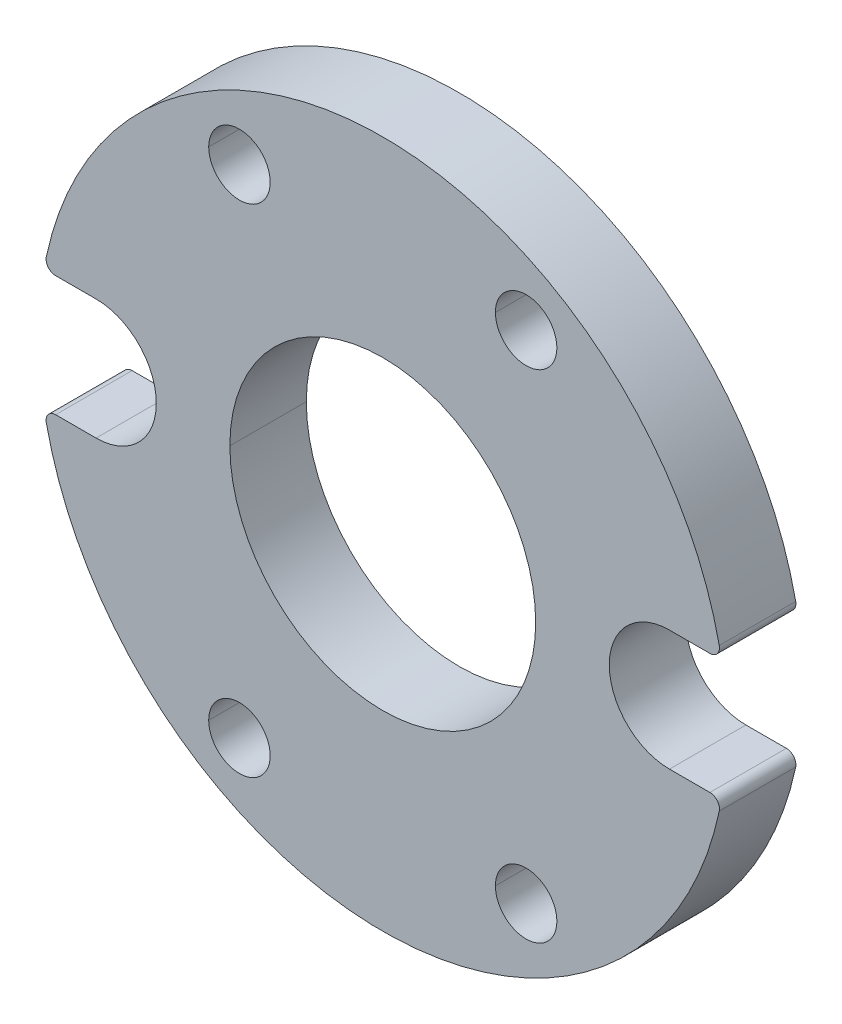
ISO-10303-21;
HEADER;
FILE_DESCRIPTION(('STEP AP214'),'2;1');
FILE_NAME('part.step','',(''),(''),'','','');
FILE_SCHEMA(('AUTOMOTIVE_DESIGN { 1 0 10303 214 1 1 1 1 }'));
ENDSEC;
DATA;
#1=APPLICATION_CONTEXT('core data for automotive mechanical design processes');
#2=APPLICATION_PROTOCOL_DEFINITION('international standard','automotive_design',2000,#1);
#3=PRODUCT_CONTEXT('',#1,'mechanical');
#4=PRODUCT('Part','Part','',(#3));
#5=PRODUCT_RELATED_PRODUCT_CATEGORY('part','',(#4));
#6=PRODUCT_DEFINITION_FORMATION('','',#4);
#7=PRODUCT_DEFINITION_CONTEXT('part definition',#1,'design');
#8=PRODUCT_DEFINITION('design','',#6,#7);
#9=PRODUCT_DEFINITION_SHAPE('','',#8);
#10=(LENGTH_UNIT() NAMED_UNIT(*) SI_UNIT(.MILLI.,.METRE.));
#11=(NAMED_UNIT(*) PLANE_ANGLE_UNIT() SI_UNIT($,.RADIAN.));
#12=(NAMED_UNIT(*) SI_UNIT($,.STERADIAN.) SOLID_ANGLE_UNIT());
#13=UNCERTAINTY_MEASURE_WITH_UNIT(LENGTH_MEASURE(1.E-05),#10,'distance_accuracy_value','');
#14=(GEOMETRIC_REPRESENTATION_CONTEXT(3) GLOBAL_UNCERTAINTY_ASSIGNED_CONTEXT((#13)) GLOBAL_UNIT_ASSIGNED_CONTEXT((#10,
#11,#12)) REPRESENTATION_CONTEXT('',''));
#15=CARTESIAN_POINT('',(0.,0.,0.));
#16=DIRECTION('',(0.,0.,1.));
#17=DIRECTION('',(1.,0.,0.));
#18=AXIS2_PLACEMENT_3D('',#15,#16,#17);
#19=CARTESIAN_POINT('',(27.1703940438854,5.79375,3.175));
#20=DIRECTION('',(0.,0.,-1.));
#21=DIRECTION('',(-1.,0.,0.));
#22=AXIS2_PLACEMENT_3D('',#19,#20,#21);
#23=CYLINDRICAL_SURFACE('',#22,0.79375);
#24=CARTESIAN_POINT('',(27.1703940438854,5.79375,-3.175));
#25=DIRECTION('',(0.,0.,-1.));
#26=DIRECTION('',(1.,0.,0.));
#27=AXIS2_PLACEMENT_3D('',#24,#25,#26);
#28=CIRCLE('',#27,0.79375);
#29=CARTESIAN_POINT('',(27.9466910165678,5.95928571428571,-3.175));
#30=VERTEX_POINT('',#29);
#31=CARTESIAN_POINT('',(27.1703940438854,5.,-3.175));
#32=VERTEX_POINT('',#31);
#33=EDGE_CURVE('E364',#30,#32,#28,.T.);
#34=ORIENTED_EDGE('',*,*,#33,.F.);
#35=DIRECTION('',(0.,0.,-1.));
#36=VECTOR('',#35,1.);
#37=CARTESIAN_POINT('',(27.9466910165678,5.95928571428571,3.175));
#38=LINE('',#37,#36);
#39=CARTESIAN_POINT('',(27.9466910165678,5.95928571428571,3.175));
#40=VERTEX_POINT('',#39);
#41=EDGE_CURVE('E263',#40,#30,#38,.T.);
#42=ORIENTED_EDGE('',*,*,#41,.F.);
#43=CARTESIAN_POINT('',(27.1703940438854,5.79375,3.175));
#44=DIRECTION('',(0.,0.,1.));
#45=DIRECTION('',(1.,0.,0.));
#46=AXIS2_PLACEMENT_3D('',#43,#44,#45);
#47=CIRCLE('',#46,0.79375);
#48=CARTESIAN_POINT('',(27.1703940438854,5.,3.175));
#49=VERTEX_POINT('',#48);
#50=EDGE_CURVE('E375',#49,#40,#47,.T.);
#51=ORIENTED_EDGE('',*,*,#50,.F.);
#52=DIRECTION('',(0.,0.,1.));
#53=VECTOR('',#52,1.);
#54=CARTESIAN_POINT('',(27.1703940438854,5.,3.175));
#55=LINE('',#54,#53);
#56=EDGE_CURVE('E291',#32,#49,#55,.T.);
#57=ORIENTED_EDGE('',*,*,#56,.F.);
#58=EDGE_LOOP('',(#34,#42,#51,#57));
#59=FACE_BOUND('',#58,.T.);
#60=ADVANCED_FACE('F17',(#59),#23,.T.);
#61=CARTESIAN_POINT('',(-27.1703940438854,5.79375,3.175));
#62=DIRECTION('',(0.,0.,-1.));
#63=DIRECTION('',(-1.,0.,0.));
#64=AXIS2_PLACEMENT_3D('',#61,#62,#63);
#65=CYLINDRICAL_SURFACE('',#64,0.79375);
#66=DIRECTION('',(0.,0.,-1.));
#67=VECTOR('',#66,1.);
#68=CARTESIAN_POINT('',(-27.9641440438854,5.79375,3.175));
#69=LINE('',#68,#67);
#70=CARTESIAN_POINT('',(-27.9641440438854,5.79375,3.175));
#71=VERTEX_POINT('',#70);
#72=CARTESIAN_POINT('',(-27.9641440438854,5.79375,-3.175));
#73=VERTEX_POINT('',#72);
#74=EDGE_CURVE('E377',#71,#73,#69,.T.);
#75=ORIENTED_EDGE('',*,*,#74,.F.);
#76=CARTESIAN_POINT('',(-27.1703940438854,5.79375,3.175));
#77=DIRECTION('',(0.,0.,1.));
#78=DIRECTION('',(1.,0.,0.));
#79=AXIS2_PLACEMENT_3D('',#76,#77,#78);
#80=CIRCLE('',#79,0.79375);
#81=CARTESIAN_POINT('',(-27.9466910165678,5.95928571428572,3.175));
#82=VERTEX_POINT('',#81);
#83=EDGE_CURVE('E303',#82,#71,#80,.T.);
#84=ORIENTED_EDGE('',*,*,#83,.F.);
#85=DIRECTION('',(0.,0.,1.));
#86=VECTOR('',#85,1.);
#87=CARTESIAN_POINT('',(-27.9466910165678,5.95928571428572,3.175));
#88=LINE('',#87,#86);
#89=CARTESIAN_POINT('',(-27.9466910165678,5.95928571428572,-3.175));
#90=VERTEX_POINT('',#89);
#91=EDGE_CURVE('E281',#90,#82,#88,.T.);
#92=ORIENTED_EDGE('',*,*,#91,.F.);
#93=CARTESIAN_POINT('',(-27.1703940438854,5.79375,-3.175));
#94=DIRECTION('',(0.,0.,-1.));
#95=DIRECTION('',(1.,0.,0.));
#96=AXIS2_PLACEMENT_3D('',#93,#94,#95);
#97=CIRCLE('',#96,0.79375);
#98=EDGE_CURVE('E338',#73,#90,#97,.T.);
#99=ORIENTED_EDGE('',*,*,#98,.F.);
#100=EDGE_LOOP('',(#75,#84,#92,#99));
#101=FACE_BOUND('',#100,.T.);
#102=ADVANCED_FACE('F564',(#101),#65,.T.);
#103=CARTESIAN_POINT('',(27.1703940438854,-5.79375,3.175));
#104=DIRECTION('',(0.,0.,-1.));
#105=DIRECTION('',(-1.,0.,0.));
#106=AXIS2_PLACEMENT_3D('',#103,#104,#105);
#107=CYLINDRICAL_SURFACE('',#106,0.79375);
#108=CARTESIAN_POINT('',(27.1703940438854,-5.79375,-3.175));
#109=DIRECTION('',(0.,0.,-1.));
#110=DIRECTION('',(1.,0.,0.));
#111=AXIS2_PLACEMENT_3D('',#108,#109,#110);
#112=CIRCLE('',#111,0.79375);
#113=CARTESIAN_POINT('',(27.1703940438854,-5.,-3.175));
#114=VERTEX_POINT('',#113);
#115=CARTESIAN_POINT('',(27.9466910165678,-5.95928571428571,-3.175));
#116=VERTEX_POINT('',#115);
#117=EDGE_CURVE('E449',#114,#116,#112,.T.);
#118=ORIENTED_EDGE('',*,*,#117,.F.);
#119=DIRECTION('',(0.,0.,-1.));
#120=VECTOR('',#119,1.);
#121=CARTESIAN_POINT('',(27.1703940438854,-5.,-3.175));
#122=LINE('',#121,#120);
#123=CARTESIAN_POINT('',(27.1703940438854,-5.,3.175));
#124=VERTEX_POINT('',#123);
#125=EDGE_CURVE('E43',#124,#114,#122,.T.);
#126=ORIENTED_EDGE('',*,*,#125,.F.);
#127=CARTESIAN_POINT('',(27.1703940438854,-5.79375,3.175));
#128=DIRECTION('',(0.,0.,1.));
#129=DIRECTION('',(1.,0.,0.));
#130=AXIS2_PLACEMENT_3D('',#127,#128,#129);
#131=CIRCLE('',#130,0.79375);
#132=CARTESIAN_POINT('',(27.9466910165678,-5.95928571428571,3.175));
#133=VERTEX_POINT('',#132);
#134=EDGE_CURVE('E288',#133,#124,#131,.T.);
#135=ORIENTED_EDGE('',*,*,#134,.F.);
#136=DIRECTION('',(0.,0.,1.));
#137=VECTOR('',#136,1.);
#138=CARTESIAN_POINT('',(27.9466910165678,-5.95928571428571,3.175));
#139=LINE('',#138,#137);
#140=EDGE_CURVE('E284',#116,#133,#139,.T.);
#141=ORIENTED_EDGE('',*,*,#140,.F.);
#142=EDGE_LOOP('',(#118,#126,#135,#141));
#143=FACE_BOUND('',#142,.T.);
#144=ADVANCED_FACE('F544',(#143),#107,.T.);
#145=CARTESIAN_POINT('',(-27.1703940438854,-5.79375,3.175));
#146=DIRECTION('',(0.,0.,-1.));
#147=DIRECTION('',(-1.,0.,0.));
#148=AXIS2_PLACEMENT_3D('',#145,#146,#147);
#149=CYLINDRICAL_SURFACE('',#148,0.79375);
#150=DIRECTION('',(0.,0.,-1.));
#151=VECTOR('',#150,1.);
#152=CARTESIAN_POINT('',(-27.9641440438854,-5.79375,3.175));
#153=LINE('',#152,#151);
#154=CARTESIAN_POINT('',(-27.9641440438854,-5.79375,3.175));
#155=VERTEX_POINT('',#154);
#156=CARTESIAN_POINT('',(-27.9641440438854,-5.79375,-3.175));
#157=VERTEX_POINT('',#156);
#158=EDGE_CURVE('E271',#155,#157,#153,.T.);
#159=ORIENTED_EDGE('',*,*,#158,.F.);
#160=CARTESIAN_POINT('',(-27.1703940438854,-5.79375,3.175));
#161=DIRECTION('',(0.,0.,1.));
#162=DIRECTION('',(1.,0.,0.));
#163=AXIS2_PLACEMENT_3D('',#160,#161,#162);
#164=CIRCLE('',#163,0.79375);
#165=CARTESIAN_POINT('',(-27.1703940438854,-5.,3.175));
#166=VERTEX_POINT('',#165);
#167=EDGE_CURVE('E276',#166,#155,#164,.T.);
#168=ORIENTED_EDGE('',*,*,#167,.F.);
#169=DIRECTION('',(0.,0.,1.));
#170=VECTOR('',#169,1.);
#171=CARTESIAN_POINT('',(-27.1703940438854,-5.,3.175));
#172=LINE('',#171,#170);
#173=CARTESIAN_POINT('',(-27.1703940438854,-5.,-3.175));
#174=VERTEX_POINT('',#173);
#175=EDGE_CURVE('E28',#174,#166,#172,.T.);
#176=ORIENTED_EDGE('',*,*,#175,.F.);
#177=CARTESIAN_POINT('',(-27.1703940438854,-5.79375,-3.175));
#178=DIRECTION('',(0.,0.,-1.));
#179=DIRECTION('',(1.,0.,0.));
#180=AXIS2_PLACEMENT_3D('',#177,#178,#179);
#181=CIRCLE('',#180,0.79375);
#182=EDGE_CURVE('E349',#157,#174,#181,.T.);
#183=ORIENTED_EDGE('',*,*,#182,.F.);
#184=EDGE_LOOP('',(#159,#168,#176,#183));
#185=FACE_BOUND('',#184,.T.);
#186=ADVANCED_FACE('F535',(#185),#149,.T.);
#187=CARTESIAN_POINT('',(-23.8125,0.,-3.175));
#188=DIRECTION('',(0.,0.,1.));
#189=DIRECTION('',(1.,0.,0.));
#190=AXIS2_PLACEMENT_3D('',#187,#188,#189);
#191=CYLINDRICAL_SURFACE('',#190,5.);
#192=DIRECTION('',(0.,0.,1.));
#193=VECTOR('',#192,1.);
#194=CARTESIAN_POINT('',(-18.8125,0.,-3.175));
#195=LINE('',#194,#193);
#196=CARTESIAN_POINT('',(-18.8125,0.,-3.175));
#197=VERTEX_POINT('',#196);
#198=CARTESIAN_POINT('',(-18.8125,0.,3.175));
#199=VERTEX_POINT('',#198);
#200=EDGE_CURVE('E337',#197,#199,#195,.T.);
#201=ORIENTED_EDGE('',*,*,#200,.F.);
#202=CARTESIAN_POINT('',(-23.8125,0.,-3.175));
#203=DIRECTION('',(0.,0.,1.));
#204=DIRECTION('',(1.,0.,0.));
#205=AXIS2_PLACEMENT_3D('',#202,#203,#204);
#206=CIRCLE('',#205,5.);
#207=CARTESIAN_POINT('',(-23.8125,-5.,-3.175));
#208=VERTEX_POINT('',#207);
#209=EDGE_CURVE('E358',#208,#197,#206,.T.);
#210=ORIENTED_EDGE('',*,*,#209,.F.);
#211=DIRECTION('',(0.,0.,1.));
#212=VECTOR('',#211,1.);
#213=CARTESIAN_POINT('',(-23.8125,-5.,-3.175));
#214=LINE('',#213,#212);
#215=CARTESIAN_POINT('',(-23.8125,-5.,3.175));
#216=VERTEX_POINT('',#215);
#217=EDGE_CURVE('E11',#208,#216,#214,.T.);
#218=ORIENTED_EDGE('',*,*,#217,.T.);
#219=CARTESIAN_POINT('',(-23.8125,0.,3.175));
#220=DIRECTION('',(0.,0.,1.));
#221=DIRECTION('',(1.,0.,0.));
#222=AXIS2_PLACEMENT_3D('',#219,#220,#221);
#223=CIRCLE('',#222,5.);
#224=EDGE_CURVE('E302',#216,#199,#223,.T.);
#225=ORIENTED_EDGE('',*,*,#224,.T.);
#226=EDGE_LOOP('',(#201,#210,#218,#225));
#227=FACE_BOUND('',#226,.T.);
#228=ADVANCED_FACE('F514',(#227),#191,.F.);
#229=CARTESIAN_POINT('',(0.,5.,-3.175));
#230=DIRECTION('',(0.,1.,0.));
#231=DIRECTION('',(1.,0.,0.));
#232=AXIS2_PLACEMENT_3D('',#229,#230,#231);
#233=PLANE('',#232);
#234=DIRECTION('',(-1.,0.,0.));
#235=VECTOR('',#234,1.);
#236=CARTESIAN_POINT('',(0.,5.,3.175));
#237=LINE('',#236,#235);
#238=CARTESIAN_POINT('',(-23.8125,5.,3.175));
#239=VERTEX_POINT('',#238);
#240=CARTESIAN_POINT('',(-27.1703940438854,5.,3.175));
#241=VERTEX_POINT('',#240);
#242=EDGE_CURVE('E299',#239,#241,#237,.T.);
#243=ORIENTED_EDGE('',*,*,#242,.T.);
#244=DIRECTION('',(0.,0.,-1.));
#245=VECTOR('',#244,1.);
#246=CARTESIAN_POINT('',(-27.1703940438854,5.,-3.175));
#247=LINE('',#246,#245);
#248=CARTESIAN_POINT('',(-27.1703940438854,5.,-3.175));
#249=VERTEX_POINT('',#248);
#250=EDGE_CURVE('E265',#241,#249,#247,.T.);
#251=ORIENTED_EDGE('',*,*,#250,.T.);
#252=DIRECTION('',(-1.,0.,0.));
#253=VECTOR('',#252,1.);
#254=CARTESIAN_POINT('',(0.,5.,-3.175));
#255=LINE('',#254,#253);
#256=CARTESIAN_POINT('',(-23.8125,5.,-3.175));
#257=VERTEX_POINT('',#256);
#258=EDGE_CURVE('E343',#257,#249,#255,.T.);
#259=ORIENTED_EDGE('',*,*,#258,.F.);
#260=DIRECTION('',(0.,0.,1.));
#261=VECTOR('',#260,1.);
#262=CARTESIAN_POINT('',(-23.8125,5.,-3.175));
#263=LINE('',#262,#261);
#264=EDGE_CURVE('E336',#257,#239,#263,.T.);
#265=ORIENTED_EDGE('',*,*,#264,.T.);
#266=EDGE_LOOP('',(#243,#251,#259,#265));
#267=FACE_BOUND('',#266,.T.);
#268=ADVANCED_FACE('F524',(#267),#233,.F.);
#269=CARTESIAN_POINT('',(0.,-5.,-3.175));
#270=DIRECTION('',(0.,1.,0.));
#271=DIRECTION('',(1.,0.,0.));
#272=AXIS2_PLACEMENT_3D('',#269,#270,#271);
#273=PLANE('',#272);
#274=DIRECTION('',(-1.,0.,0.));
#275=VECTOR('',#274,1.);
#276=CARTESIAN_POINT('',(0.,-5.,-3.175));
#277=LINE('',#276,#275);
#278=EDGE_CURVE('E353',#208,#174,#277,.T.);
#279=ORIENTED_EDGE('',*,*,#278,.T.);
#280=ORIENTED_EDGE('',*,*,#175,.T.);
#281=DIRECTION('',(-1.,0.,0.));
#282=VECTOR('',#281,1.);
#283=CARTESIAN_POINT('',(0.,-5.,3.175));
#284=LINE('',#283,#282);
#285=EDGE_CURVE('E279',#216,#166,#284,.T.);
#286=ORIENTED_EDGE('',*,*,#285,.F.);
#287=ORIENTED_EDGE('',*,*,#217,.F.);
#288=EDGE_LOOP('',(#279,#280,#286,#287));
#289=FACE_BOUND('',#288,.T.);
#290=ADVANCED_FACE('F530',(#289),#273,.T.);
#291=CARTESIAN_POINT('',(23.8125,0.,-3.175));
#292=DIRECTION('',(0.,0.,1.));
#293=DIRECTION('',(1.,0.,0.));
#294=AXIS2_PLACEMENT_3D('',#291,#292,#293);
#295=CYLINDRICAL_SURFACE('',#294,5.);
#296=CARTESIAN_POINT('',(23.8125,0.,3.175));
#297=DIRECTION('',(0.,0.,1.));
#298=DIRECTION('',(1.,0.,0.));
#299=AXIS2_PLACEMENT_3D('',#296,#297,#298);
#300=CIRCLE('',#299,5.);
#301=CARTESIAN_POINT('',(23.8125,5.,3.175));
#302=VERTEX_POINT('',#301);
#303=CARTESIAN_POINT('',(23.8125,-5.,3.175));
#304=VERTEX_POINT('',#303);
#305=EDGE_CURVE('E376',#302,#304,#300,.T.);
#306=ORIENTED_EDGE('',*,*,#305,.T.);
#307=DIRECTION('',(0.,0.,1.));
#308=VECTOR('',#307,1.);
#309=CARTESIAN_POINT('',(23.8125,-5.,-3.175));
#310=LINE('',#309,#308);
#311=CARTESIAN_POINT('',(23.8125,-5.,-3.175));
#312=VERTEX_POINT('',#311);
#313=EDGE_CURVE('E85',#312,#304,#310,.T.);
#314=ORIENTED_EDGE('',*,*,#313,.F.);
#315=CARTESIAN_POINT('',(23.8125,0.,-3.175));
#316=DIRECTION('',(0.,0.,1.));
#317=DIRECTION('',(1.,0.,0.));
#318=AXIS2_PLACEMENT_3D('',#315,#316,#317);
#319=CIRCLE('',#318,5.);
#320=CARTESIAN_POINT('',(23.8125,5.,-3.175));
#321=VERTEX_POINT('',#320);
#322=EDGE_CURVE('E405',#321,#312,#319,.T.);
#323=ORIENTED_EDGE('',*,*,#322,.F.);
#324=DIRECTION('',(0.,0.,1.));
#325=VECTOR('',#324,1.);
#326=CARTESIAN_POINT('',(23.8125,5.,-3.175));
#327=LINE('',#326,#325);
#328=EDGE_CURVE('E71',#321,#302,#327,.T.);
#329=ORIENTED_EDGE('',*,*,#328,.T.);
#330=EDGE_LOOP('',(#306,#314,#323,#329));
#331=FACE_BOUND('',#330,.T.);
#332=ADVANCED_FACE('F549',(#331),#295,.F.);
#333=CARTESIAN_POINT('',(0.,-5.,-3.175));
#334=DIRECTION('',(0.,-1.,0.));
#335=DIRECTION('',(0.,0.,-1.));
#336=AXIS2_PLACEMENT_3D('',#333,#334,#335);
#337=PLANE('',#336);
#338=DIRECTION('',(1.,0.,0.));
#339=VECTOR('',#338,1.);
#340=CARTESIAN_POINT('',(0.,-5.,3.175));
#341=LINE('',#340,#339);
#342=EDGE_CURVE('E425',#304,#124,#341,.T.);
#343=ORIENTED_EDGE('',*,*,#342,.T.);
#344=ORIENTED_EDGE('',*,*,#125,.T.);
#345=DIRECTION('',(1.,0.,0.));
#346=VECTOR('',#345,1.);
#347=CARTESIAN_POINT('',(0.,-5.,-3.175));
#348=LINE('',#347,#346);
#349=EDGE_CURVE('E453',#312,#114,#348,.T.);
#350=ORIENTED_EDGE('',*,*,#349,.F.);
#351=ORIENTED_EDGE('',*,*,#313,.T.);
#352=EDGE_LOOP('',(#343,#344,#350,#351));
#353=FACE_BOUND('',#352,.T.);
#354=ADVANCED_FACE('F546',(#353),#337,.F.);
#355=CARTESIAN_POINT('',(0.,5.,-3.175));
#356=DIRECTION('',(0.,-1.,0.));
#357=DIRECTION('',(0.,0.,-1.));
#358=AXIS2_PLACEMENT_3D('',#355,#356,#357);
#359=PLANE('',#358);
#360=DIRECTION('',(1.,0.,0.));
#361=VECTOR('',#360,1.);
#362=CARTESIAN_POINT('',(0.,5.,-3.175));
#363=LINE('',#362,#361);
#364=EDGE_CURVE('E385',#321,#32,#363,.T.);
#365=ORIENTED_EDGE('',*,*,#364,.T.);
#366=ORIENTED_EDGE('',*,*,#56,.T.);
#367=DIRECTION('',(1.,0.,0.));
#368=VECTOR('',#367,1.);
#369=CARTESIAN_POINT('',(0.,5.,3.175));
#370=LINE('',#369,#368);
#371=EDGE_CURVE('E371',#302,#49,#370,.T.);
#372=ORIENTED_EDGE('',*,*,#371,.F.);
#373=ORIENTED_EDGE('',*,*,#328,.F.);
#374=EDGE_LOOP('',(#365,#366,#372,#373));
#375=FACE_BOUND('',#374,.T.);
#376=ADVANCED_FACE('F548',(#375),#359,.T.);
#377=CARTESIAN_POINT('',(11.9062500000002,-20.6222299276168,-3.175));
#378=DIRECTION('',(0.,0.,1.));
#379=DIRECTION('',(1.,0.,0.));
#380=AXIS2_PLACEMENT_3D('',#377,#378,#379);
#381=CYLINDRICAL_SURFACE('',#380,2.5527);
#382=DIRECTION('',(0.,0.,1.));
#383=VECTOR('',#382,1.);
#384=CARTESIAN_POINT('',(9.35355000000024,-20.6222299276168,-3.175));
#385=LINE('',#384,#383);
#386=CARTESIAN_POINT('',(9.35355000000024,-20.6222299276168,-3.175));
#387=VERTEX_POINT('',#386);
#388=CARTESIAN_POINT('',(9.35355000000024,-20.6222299276168,3.175));
#389=VERTEX_POINT('',#388);
#390=EDGE_CURVE('E357',#387,#389,#385,.T.);
#391=ORIENTED_EDGE('',*,*,#390,.F.);
#392=CARTESIAN_POINT('',(11.9062500000002,-20.6222299276168,-3.175));
#393=DIRECTION('',(0.,0.,1.));
#394=DIRECTION('',(0.50000000000001,-0.866025403784433,0.));
#395=AXIS2_PLACEMENT_3D('',#392,#393,#394);
#396=CIRCLE('',#395,2.5527);
#397=CARTESIAN_POINT('',(14.4589500000002,-20.6222299276168,-3.175));
#398=VERTEX_POINT('',#397);
#399=EDGE_CURVE('E410',#398,#387,#396,.T.);
#400=ORIENTED_EDGE('',*,*,#399,.F.);
#401=DIRECTION('',(0.,0.,1.));
#402=VECTOR('',#401,1.);
#403=CARTESIAN_POINT('',(14.4589500000002,-20.6222299276168,-3.175));
#404=LINE('',#403,#402);
#405=CARTESIAN_POINT('',(14.4589500000002,-20.6222299276168,3.175));
#406=VERTEX_POINT('',#405);
#407=EDGE_CURVE('E304',#398,#406,#404,.T.);
#408=ORIENTED_EDGE('',*,*,#407,.T.);
#409=CARTESIAN_POINT('',(11.9062500000002,-20.6222299276168,3.175));
#410=DIRECTION('',(0.,0.,1.));
#411=DIRECTION('',(0.50000000000001,-0.866025403784433,0.));
#412=AXIS2_PLACEMENT_3D('',#409,#410,#411);
#413=CIRCLE('',#412,2.5527);
#414=EDGE_CURVE('E430',#406,#389,#413,.T.);
#415=ORIENTED_EDGE('',*,*,#414,.T.);
#416=EDGE_LOOP('',(#391,#400,#408,#415));
#417=FACE_BOUND('',#416,.T.);
#418=ADVANCED_FACE('F557',(#417),#381,.F.);
#419=CARTESIAN_POINT('',(-11.9062499999998,-20.622229927617,-3.175));
#420=DIRECTION('',(0.,0.,1.));
#421=DIRECTION('',(1.,0.,0.));
#422=AXIS2_PLACEMENT_3D('',#419,#420,#421);
#423=CYLINDRICAL_SURFACE('',#422,2.5527);
#424=DIRECTION('',(0.,0.,1.));
#425=VECTOR('',#424,1.);
#426=CARTESIAN_POINT('',(-14.4589499999998,-20.622229927617,-3.175));
#427=LINE('',#426,#425);
#428=CARTESIAN_POINT('',(-14.4589499999998,-20.622229927617,-3.175));
#429=VERTEX_POINT('',#428);
#430=CARTESIAN_POINT('',(-14.4589499999998,-20.622229927617,3.175));
#431=VERTEX_POINT('',#430);
#432=EDGE_CURVE('E320',#429,#431,#427,.T.);
#433=ORIENTED_EDGE('',*,*,#432,.F.);
#434=CARTESIAN_POINT('',(-11.9062499999998,-20.622229927617,-3.175));
#435=DIRECTION('',(0.,0.,1.));
#436=DIRECTION('',(-0.499999999999992,-0.866025403784443,0.));
#437=AXIS2_PLACEMENT_3D('',#434,#435,#436);
#438=CIRCLE('',#437,2.5527);
#439=CARTESIAN_POINT('',(-9.35354999999981,-20.622229927617,-3.175));
#440=VERTEX_POINT('',#439);
#441=EDGE_CURVE('E348',#440,#429,#438,.T.);
#442=ORIENTED_EDGE('',*,*,#441,.F.);
#443=DIRECTION('',(0.,0.,1.));
#444=VECTOR('',#443,1.);
#445=CARTESIAN_POINT('',(-9.35354999999981,-20.622229927617,-3.175));
#446=LINE('',#445,#444);
#447=CARTESIAN_POINT('',(-9.35354999999981,-20.622229927617,3.175));
#448=VERTEX_POINT('',#447);
#449=EDGE_CURVE('E319',#440,#448,#446,.T.);
#450=ORIENTED_EDGE('',*,*,#449,.T.);
#451=CARTESIAN_POINT('',(-11.9062499999998,-20.622229927617,3.175));
#452=DIRECTION('',(0.,0.,1.));
#453=DIRECTION('',(-0.499999999999992,-0.866025403784443,0.));
#454=AXIS2_PLACEMENT_3D('',#451,#452,#453);
#455=CIRCLE('',#454,2.5527);
#456=EDGE_CURVE('E459',#448,#431,#455,.T.);
#457=ORIENTED_EDGE('',*,*,#456,.T.);
#458=EDGE_LOOP('',(#433,#442,#450,#457));
#459=FACE_BOUND('',#458,.T.);
#460=ADVANCED_FACE('F590',(#459),#423,.F.);
#461=CARTESIAN_POINT('',(-11.90625,20.6222299276169,-3.175));
#462=DIRECTION('',(0.,0.,1.));
#463=DIRECTION('',(1.,0.,0.));
#464=AXIS2_PLACEMENT_3D('',#461,#462,#463);
#465=CYLINDRICAL_SURFACE('',#464,2.5527);
#466=DIRECTION('',(0.,0.,1.));
#467=VECTOR('',#466,1.);
#468=CARTESIAN_POINT('',(-14.45895,20.6222299276169,-3.175));
#469=LINE('',#468,#467);
#470=CARTESIAN_POINT('',(-14.45895,20.6222299276169,-3.175));
#471=VERTEX_POINT('',#470);
#472=CARTESIAN_POINT('',(-14.45895,20.6222299276169,3.175));
#473=VERTEX_POINT('',#472);
#474=EDGE_CURVE('E393',#471,#473,#469,.T.);
#475=ORIENTED_EDGE('',*,*,#474,.F.);
#476=CARTESIAN_POINT('',(-11.90625,20.6222299276169,-3.175));
#477=DIRECTION('',(0.,0.,1.));
#478=DIRECTION('',(-0.5,0.866025403784436,0.));
#479=AXIS2_PLACEMENT_3D('',#476,#477,#478);
#480=CIRCLE('',#479,2.5527);
#481=CARTESIAN_POINT('',(-9.35355,20.6222299276169,-3.175));
#482=VERTEX_POINT('',#481);
#483=EDGE_CURVE('E344',#482,#471,#480,.T.);
#484=ORIENTED_EDGE('',*,*,#483,.F.);
#485=DIRECTION('',(0.,0.,1.));
#486=VECTOR('',#485,1.);
#487=CARTESIAN_POINT('',(-9.35355,20.6222299276169,-3.175));
#488=LINE('',#487,#486);
#489=CARTESIAN_POINT('',(-9.35355,20.6222299276169,3.175));
#490=VERTEX_POINT('',#489);
#491=EDGE_CURVE('E326',#482,#490,#488,.T.);
#492=ORIENTED_EDGE('',*,*,#491,.T.);
#493=CARTESIAN_POINT('',(-11.90625,20.6222299276169,3.175));
#494=DIRECTION('',(0.,0.,1.));
#495=DIRECTION('',(-0.5,0.866025403784436,0.));
#496=AXIS2_PLACEMENT_3D('',#493,#494,#495);
#497=CIRCLE('',#496,2.5527);
#498=EDGE_CURVE('E468',#490,#473,#497,.T.);
#499=ORIENTED_EDGE('',*,*,#498,.T.);
#500=EDGE_LOOP('',(#475,#484,#492,#499));
#501=FACE_BOUND('',#500,.T.);
#502=ADVANCED_FACE('F613',(#501),#465,.F.);
#503=CARTESIAN_POINT('',(11.90625,20.6222299276169,-3.175));
#504=DIRECTION('',(0.,0.,1.));
#505=DIRECTION('',(1.,0.,0.));
#506=AXIS2_PLACEMENT_3D('',#503,#504,#505);
#507=CYLINDRICAL_SURFACE('',#506,2.5527);
#508=DIRECTION('',(0.,0.,1.));
#509=VECTOR('',#508,1.);
#510=CARTESIAN_POINT('',(9.35355,20.6222299276169,-3.175));
#511=LINE('',#510,#509);
#512=CARTESIAN_POINT('',(9.35355,20.6222299276169,-3.175));
#513=VERTEX_POINT('',#512);
#514=CARTESIAN_POINT('',(9.35355,20.6222299276169,3.175));
#515=VERTEX_POINT('',#514);
#516=EDGE_CURVE('E294',#513,#515,#511,.T.);
#517=ORIENTED_EDGE('',*,*,#516,.F.);
#518=CARTESIAN_POINT('',(11.90625,20.6222299276169,-3.175));
#519=DIRECTION('',(0.,0.,1.));
#520=DIRECTION('',(0.5,0.86602540378444,0.));
#521=AXIS2_PLACEMENT_3D('',#518,#519,#520);
#522=CIRCLE('',#521,2.5527);
#523=CARTESIAN_POINT('',(14.45895,20.6222299276169,-3.175));
#524=VERTEX_POINT('',#523);
#525=EDGE_CURVE('E347',#524,#513,#522,.T.);
#526=ORIENTED_EDGE('',*,*,#525,.F.);
#527=DIRECTION('',(0.,0.,1.));
#528=VECTOR('',#527,1.);
#529=CARTESIAN_POINT('',(14.45895,20.6222299276169,-3.175));
#530=LINE('',#529,#528);
#531=CARTESIAN_POINT('',(14.45895,20.6222299276169,3.175));
#532=VERTEX_POINT('',#531);
#533=EDGE_CURVE('E253',#524,#532,#530,.T.);
#534=ORIENTED_EDGE('',*,*,#533,.T.);
#535=CARTESIAN_POINT('',(11.90625,20.6222299276169,3.175));
#536=DIRECTION('',(0.,0.,1.));
#537=DIRECTION('',(0.5,0.86602540378444,0.));
#538=AXIS2_PLACEMENT_3D('',#535,#536,#537);
#539=CIRCLE('',#538,2.5527);
#540=EDGE_CURVE('E238',#532,#515,#539,.T.);
#541=ORIENTED_EDGE('',*,*,#540,.T.);
#542=EDGE_LOOP('',(#517,#526,#534,#541));
#543=FACE_BOUND('',#542,.T.);
#544=ADVANCED_FACE('F585',(#543),#507,.F.);
#545=CARTESIAN_POINT('',(0.,0.,3.175));
#546=DIRECTION('',(0.,0.,-1.));
#547=DIRECTION('',(-1.,0.,0.));
#548=AXIS2_PLACEMENT_3D('',#545,#546,#547);
#549=CYLINDRICAL_SURFACE('',#548,12.7);
#550=DIRECTION('',(0.,0.,-1.));
#551=VECTOR('',#550,1.);
#552=CARTESIAN_POINT('',(12.7,0.,3.175));
#553=LINE('',#552,#551);
#554=CARTESIAN_POINT('',(12.7,0.,3.175));
#555=VERTEX_POINT('',#554);
#556=CARTESIAN_POINT('',(12.7,0.,-3.175));
#557=VERTEX_POINT('',#556);
#558=EDGE_CURVE('E241',#555,#557,#553,.T.);
#559=ORIENTED_EDGE('',*,*,#558,.F.);
#560=CARTESIAN_POINT('',(0.,0.,3.175));
#561=DIRECTION('',(0.,0.,1.));
#562=DIRECTION('',(1.,0.,0.));
#563=AXIS2_PLACEMENT_3D('',#560,#561,#562);
#564=CIRCLE('',#563,12.7);
#565=CARTESIAN_POINT('',(-12.7,0.,3.175));
#566=VERTEX_POINT('',#565);
#567=EDGE_CURVE('E227',#555,#566,#564,.T.);
#568=ORIENTED_EDGE('',*,*,#567,.T.);
#569=DIRECTION('',(0.,0.,-1.));
#570=VECTOR('',#569,1.);
#571=CARTESIAN_POINT('',(-12.7,0.,3.175));
#572=LINE('',#571,#570);
#573=CARTESIAN_POINT('',(-12.7,0.,-3.175));
#574=VERTEX_POINT('',#573);
#575=EDGE_CURVE('E251',#566,#574,#572,.T.);
#576=ORIENTED_EDGE('',*,*,#575,.T.);
#577=CARTESIAN_POINT('',(0.,0.,-3.175));
#578=DIRECTION('',(0.,0.,1.));
#579=DIRECTION('',(1.,0.,0.));
#580=AXIS2_PLACEMENT_3D('',#577,#578,#579);
#581=CIRCLE('',#580,12.7);
#582=EDGE_CURVE('E243',#557,#574,#581,.T.);
#583=ORIENTED_EDGE('',*,*,#582,.F.);
#584=EDGE_LOOP('',(#559,#568,#576,#583));
#585=FACE_BOUND('',#584,.T.);
#586=ADVANCED_FACE('F242',(#585),#549,.F.);
#587=CARTESIAN_POINT('',(0.,0.,3.175));
#588=DIRECTION('',(0.,0.,-1.));
#589=DIRECTION('',(-1.,0.,0.));
#590=AXIS2_PLACEMENT_3D('',#587,#588,#589);
#591=CYLINDRICAL_SURFACE('',#590,28.575);
#592=CARTESIAN_POINT('',(0.,0.,-3.175));
#593=DIRECTION('',(0.,0.,1.));
#594=DIRECTION('',(1.,0.,0.));
#595=AXIS2_PLACEMENT_3D('',#592,#593,#594);
#596=CIRCLE('',#595,28.575);
#597=EDGE_CURVE('E342',#30,#90,#596,.T.);
#598=ORIENTED_EDGE('',*,*,#597,.T.);
#599=ORIENTED_EDGE('',*,*,#91,.T.);
#600=CARTESIAN_POINT('',(0.,0.,3.175));
#601=DIRECTION('',(0.,0.,1.));
#602=DIRECTION('',(1.,0.,0.));
#603=AXIS2_PLACEMENT_3D('',#600,#601,#602);
#604=CIRCLE('',#603,28.575);
#605=EDGE_CURVE('E314',#40,#82,#604,.T.);
#606=ORIENTED_EDGE('',*,*,#605,.F.);
#607=ORIENTED_EDGE('',*,*,#41,.T.);
#608=EDGE_LOOP('',(#598,#599,#606,#607));
#609=FACE_BOUND('',#608,.T.);
#610=ADVANCED_FACE('F584',(#609),#591,.T.);
#611=CARTESIAN_POINT('',(0.,0.,3.175));
#612=DIRECTION('',(0.,0.,-1.));
#613=DIRECTION('',(-1.,0.,0.));
#614=AXIS2_PLACEMENT_3D('',#611,#612,#613);
#615=CYLINDRICAL_SURFACE('',#614,28.575);
#616=CARTESIAN_POINT('',(0.,0.,3.175));
#617=DIRECTION('',(0.,0.,1.));
#618=DIRECTION('',(1.,0.,0.));
#619=AXIS2_PLACEMENT_3D('',#616,#617,#618);
#620=CIRCLE('',#619,28.575);
#621=CARTESIAN_POINT('',(-27.9466910165678,-5.95928571428572,3.175));
#622=VERTEX_POINT('',#621);
#623=EDGE_CURVE('E278',#622,#133,#620,.T.);
#624=ORIENTED_EDGE('',*,*,#623,.F.);
#625=DIRECTION('',(0.,0.,-1.));
#626=VECTOR('',#625,1.);
#627=CARTESIAN_POINT('',(-27.9466910165678,-5.95928571428572,3.175));
#628=LINE('',#627,#626);
#629=CARTESIAN_POINT('',(-27.9466910165678,-5.95928571428572,-3.175));
#630=VERTEX_POINT('',#629);
#631=EDGE_CURVE('E327',#622,#630,#628,.T.);
#632=ORIENTED_EDGE('',*,*,#631,.T.);
#633=CARTESIAN_POINT('',(0.,0.,-3.175));
#634=DIRECTION('',(0.,0.,1.));
#635=DIRECTION('',(1.,0.,0.));
#636=AXIS2_PLACEMENT_3D('',#633,#634,#635);
#637=CIRCLE('',#636,28.575);
#638=EDGE_CURVE('E237',#630,#116,#637,.T.);
#639=ORIENTED_EDGE('',*,*,#638,.T.);
#640=ORIENTED_EDGE('',*,*,#140,.T.);
#641=EDGE_LOOP('',(#624,#632,#639,#640));
#642=FACE_BOUND('',#641,.T.);
#643=ADVANCED_FACE('F540',(#642),#615,.T.);
#644=CARTESIAN_POINT('',(0.,0.,-3.175));
#645=DIRECTION('',(0.,0.,1.));
#646=DIRECTION('',(1.,0.,0.));
#647=AXIS2_PLACEMENT_3D('',#644,#645,#646);
#648=PLANE('',#647);
#649=CARTESIAN_POINT('',(0.,0.,-3.175));
#650=DIRECTION('',(0.,0.,1.));
#651=DIRECTION('',(1.,0.,0.));
#652=AXIS2_PLACEMENT_3D('',#649,#650,#651);
#653=CIRCLE('',#652,12.7);
#654=EDGE_CURVE('E248',#574,#557,#653,.T.);
#655=ORIENTED_EDGE('',*,*,#654,.T.);
#656=ORIENTED_EDGE('',*,*,#582,.T.);
#657=EDGE_LOOP('',(#655,#656));
#658=FACE_BOUND('',#657,.T.);
#659=ORIENTED_EDGE('',*,*,#525,.T.);
#660=CARTESIAN_POINT('',(11.90625,20.6222299276169,-3.175));
#661=DIRECTION('',(0.,0.,1.));
#662=DIRECTION('',(0.5,0.86602540378444,0.));
#663=AXIS2_PLACEMENT_3D('',#660,#661,#662);
#664=CIRCLE('',#663,2.5527);
#665=EDGE_CURVE('E298',#513,#524,#664,.T.);
#666=ORIENTED_EDGE('',*,*,#665,.T.);
#667=EDGE_LOOP('',(#659,#666));
#668=FACE_BOUND('',#667,.T.);
#669=ORIENTED_EDGE('',*,*,#483,.T.);
#670=CARTESIAN_POINT('',(-11.90625,20.6222299276169,-3.175));
#671=DIRECTION('',(0.,0.,1.));
#672=DIRECTION('',(-0.5,0.866025403784436,0.));
#673=AXIS2_PLACEMENT_3D('',#670,#671,#672);
#674=CIRCLE('',#673,2.5527);
#675=EDGE_CURVE('E398',#471,#482,#674,.T.);
#676=ORIENTED_EDGE('',*,*,#675,.T.);
#677=EDGE_LOOP('',(#669,#676));
#678=FACE_BOUND('',#677,.T.);
#679=ORIENTED_EDGE('',*,*,#441,.T.);
#680=CARTESIAN_POINT('',(-11.9062499999998,-20.622229927617,-3.175));
#681=DIRECTION('',(0.,0.,1.));
#682=DIRECTION('',(-0.499999999999992,-0.866025403784443,0.));
#683=AXIS2_PLACEMENT_3D('',#680,#681,#682);
#684=CIRCLE('',#683,2.5527);
#685=EDGE_CURVE('E308',#429,#440,#684,.T.);
#686=ORIENTED_EDGE('',*,*,#685,.T.);
#687=EDGE_LOOP('',(#679,#686));
#688=FACE_BOUND('',#687,.T.);
#689=ORIENTED_EDGE('',*,*,#399,.T.);
#690=CARTESIAN_POINT('',(11.9062500000002,-20.6222299276168,-3.175));
#691=DIRECTION('',(0.,0.,1.));
#692=DIRECTION('',(0.50000000000001,-0.866025403784433,0.));
#693=AXIS2_PLACEMENT_3D('',#690,#691,#692);
#694=CIRCLE('',#693,2.5527);
#695=EDGE_CURVE('E389',#387,#398,#694,.T.);
#696=ORIENTED_EDGE('',*,*,#695,.T.);
#697=EDGE_LOOP('',(#689,#696));
#698=FACE_BOUND('',#697,.T.);
#699=ORIENTED_EDGE('',*,*,#638,.F.);
#700=CARTESIAN_POINT('',(-27.1703940438854,-5.79375,-3.175));
#701=DIRECTION('',(0.,0.,-1.));
#702=DIRECTION('',(1.,0.,0.));
#703=AXIS2_PLACEMENT_3D('',#700,#701,#702);
#704=CIRCLE('',#703,0.79375);
#705=EDGE_CURVE('E275',#630,#157,#704,.T.);
#706=ORIENTED_EDGE('',*,*,#705,.T.);
#707=ORIENTED_EDGE('',*,*,#182,.T.);
#708=ORIENTED_EDGE('',*,*,#278,.F.);
#709=ORIENTED_EDGE('',*,*,#209,.T.);
#710=CARTESIAN_POINT('',(-23.8125,0.,-3.175));
#711=DIRECTION('',(0.,0.,1.));
#712=DIRECTION('',(1.,0.,0.));
#713=AXIS2_PLACEMENT_3D('',#710,#711,#712);
#714=CIRCLE('',#713,5.);
#715=EDGE_CURVE('E331',#197,#257,#714,.T.);
#716=ORIENTED_EDGE('',*,*,#715,.T.);
#717=ORIENTED_EDGE('',*,*,#258,.T.);
#718=CARTESIAN_POINT('',(-27.1703940438854,5.79375,-3.175));
#719=DIRECTION('',(0.,0.,-1.));
#720=DIRECTION('',(1.,0.,0.));
#721=AXIS2_PLACEMENT_3D('',#718,#719,#720);
#722=CIRCLE('',#721,0.79375);
#723=EDGE_CURVE('E270',#249,#73,#722,.T.);
#724=ORIENTED_EDGE('',*,*,#723,.T.);
#725=ORIENTED_EDGE('',*,*,#98,.T.);
#726=ORIENTED_EDGE('',*,*,#597,.F.);
#727=ORIENTED_EDGE('',*,*,#33,.T.);
#728=ORIENTED_EDGE('',*,*,#364,.F.);
#729=ORIENTED_EDGE('',*,*,#322,.T.);
#730=ORIENTED_EDGE('',*,*,#349,.T.);
#731=ORIENTED_EDGE('',*,*,#117,.T.);
#732=EDGE_LOOP('',(#699,#706,#707,#708,#709,#716,#717,#724,#725,#726,#727,#728,#729,#730,#731));
#733=FACE_BOUND('',#732,.T.);
#734=ADVANCED_FACE('F528',(#658,#668,#678,#688,#698,#733),#648,.F.);
#735=CARTESIAN_POINT('',(0.,0.,3.175));
#736=DIRECTION('',(0.,0.,1.));
#737=DIRECTION('',(1.,0.,0.));
#738=AXIS2_PLACEMENT_3D('',#735,#736,#737);
#739=PLANE('',#738);
#740=CARTESIAN_POINT('',(0.,0.,3.175));
#741=DIRECTION('',(0.,0.,1.));
#742=DIRECTION('',(1.,0.,0.));
#743=AXIS2_PLACEMENT_3D('',#740,#741,#742);
#744=CIRCLE('',#743,12.7);
#745=EDGE_CURVE('E232',#566,#555,#744,.T.);
#746=ORIENTED_EDGE('',*,*,#745,.F.);
#747=ORIENTED_EDGE('',*,*,#567,.F.);
#748=EDGE_LOOP('',(#746,#747));
#749=FACE_BOUND('',#748,.T.);
#750=ORIENTED_EDGE('',*,*,#540,.F.);
#751=CARTESIAN_POINT('',(11.90625,20.6222299276169,3.175));
#752=DIRECTION('',(0.,0.,1.));
#753=DIRECTION('',(0.5,0.86602540378444,0.));
#754=AXIS2_PLACEMENT_3D('',#751,#752,#753);
#755=CIRCLE('',#754,2.5527);
#756=EDGE_CURVE('E21',#515,#532,#755,.T.);
#757=ORIENTED_EDGE('',*,*,#756,.F.);
#758=EDGE_LOOP('',(#750,#757));
#759=FACE_BOUND('',#758,.T.);
#760=ORIENTED_EDGE('',*,*,#498,.F.);
#761=CARTESIAN_POINT('',(-11.90625,20.6222299276169,3.175));
#762=DIRECTION('',(0.,0.,1.));
#763=DIRECTION('',(-0.5,0.866025403784436,0.));
#764=AXIS2_PLACEMENT_3D('',#761,#762,#763);
#765=CIRCLE('',#764,2.5527);
#766=EDGE_CURVE('E397',#473,#490,#765,.T.);
#767=ORIENTED_EDGE('',*,*,#766,.F.);
#768=EDGE_LOOP('',(#760,#767));
#769=FACE_BOUND('',#768,.T.);
#770=ORIENTED_EDGE('',*,*,#456,.F.);
#771=CARTESIAN_POINT('',(-11.9062499999998,-20.622229927617,3.175));
#772=DIRECTION('',(0.,0.,1.));
#773=DIRECTION('',(-0.499999999999992,-0.866025403784443,0.));
#774=AXIS2_PLACEMENT_3D('',#771,#772,#773);
#775=CIRCLE('',#774,2.5527);
#776=EDGE_CURVE('E315',#431,#448,#775,.T.);
#777=ORIENTED_EDGE('',*,*,#776,.F.);
#778=EDGE_LOOP('',(#770,#777));
#779=FACE_BOUND('',#778,.T.);
#780=ORIENTED_EDGE('',*,*,#414,.F.);
#781=CARTESIAN_POINT('',(11.9062500000002,-20.6222299276168,3.175));
#782=DIRECTION('',(0.,0.,1.));
#783=DIRECTION('',(0.50000000000001,-0.866025403784433,0.));
#784=AXIS2_PLACEMENT_3D('',#781,#782,#783);
#785=CIRCLE('',#784,2.5527);
#786=EDGE_CURVE('E309',#389,#406,#785,.T.);
#787=ORIENTED_EDGE('',*,*,#786,.F.);
#788=EDGE_LOOP('',(#780,#787));
#789=FACE_BOUND('',#788,.T.);
#790=ORIENTED_EDGE('',*,*,#285,.T.);
#791=ORIENTED_EDGE('',*,*,#167,.T.);
#792=CARTESIAN_POINT('',(-27.1703940438854,-5.79375,3.175));
#793=DIRECTION('',(0.,0.,1.));
#794=DIRECTION('',(1.,0.,0.));
#795=AXIS2_PLACEMENT_3D('',#792,#793,#794);
#796=CIRCLE('',#795,0.79375);
#797=EDGE_CURVE('E269',#155,#622,#796,.T.);
#798=ORIENTED_EDGE('',*,*,#797,.T.);
#799=ORIENTED_EDGE('',*,*,#623,.T.);
#800=ORIENTED_EDGE('',*,*,#134,.T.);
#801=ORIENTED_EDGE('',*,*,#342,.F.);
#802=ORIENTED_EDGE('',*,*,#305,.F.);
#803=ORIENTED_EDGE('',*,*,#371,.T.);
#804=ORIENTED_EDGE('',*,*,#50,.T.);
#805=ORIENTED_EDGE('',*,*,#605,.T.);
#806=ORIENTED_EDGE('',*,*,#83,.T.);
#807=CARTESIAN_POINT('',(-27.1703940438854,5.79375,3.175));
#808=DIRECTION('',(0.,0.,1.));
#809=DIRECTION('',(1.,0.,0.));
#810=AXIS2_PLACEMENT_3D('',#807,#808,#809);
#811=CIRCLE('',#810,0.79375);
#812=EDGE_CURVE('E381',#71,#241,#811,.T.);
#813=ORIENTED_EDGE('',*,*,#812,.T.);
#814=ORIENTED_EDGE('',*,*,#242,.F.);
#815=CARTESIAN_POINT('',(-23.8125,0.,3.175));
#816=DIRECTION('',(0.,0.,1.));
#817=DIRECTION('',(1.,0.,0.));
#818=AXIS2_PLACEMENT_3D('',#815,#816,#817);
#819=CIRCLE('',#818,5.);
#820=EDGE_CURVE('E332',#199,#239,#819,.T.);
#821=ORIENTED_EDGE('',*,*,#820,.F.);
#822=ORIENTED_EDGE('',*,*,#224,.F.);
#823=EDGE_LOOP('',(#790,#791,#798,#799,#800,#801,#802,#803,#804,#805,#806,#813,#814,#821,#822));
#824=FACE_BOUND('',#823,.T.);
#825=ADVANCED_FACE('F229',(#749,#759,#769,#779,#789,#824),#739,.T.);
#826=CARTESIAN_POINT('',(0.,0.,3.175));
#827=DIRECTION('',(0.,0.,-1.));
#828=DIRECTION('',(-1.,0.,0.));
#829=AXIS2_PLACEMENT_3D('',#826,#827,#828);
#830=CYLINDRICAL_SURFACE('',#829,12.7);
#831=ORIENTED_EDGE('',*,*,#745,.T.);
#832=ORIENTED_EDGE('',*,*,#558,.T.);
#833=ORIENTED_EDGE('',*,*,#654,.F.);
#834=ORIENTED_EDGE('',*,*,#575,.F.);
#835=EDGE_LOOP('',(#831,#832,#833,#834));
#836=FACE_BOUND('',#835,.T.);
#837=ADVANCED_FACE('F250',(#836),#830,.F.);
#838=CARTESIAN_POINT('',(11.90625,20.6222299276169,-3.175));
#839=DIRECTION('',(0.,0.,1.));
#840=DIRECTION('',(1.,0.,0.));
#841=AXIS2_PLACEMENT_3D('',#838,#839,#840);
#842=CYLINDRICAL_SURFACE('',#841,2.5527);
#843=ORIENTED_EDGE('',*,*,#665,.F.);
#844=ORIENTED_EDGE('',*,*,#516,.T.);
#845=ORIENTED_EDGE('',*,*,#756,.T.);
#846=ORIENTED_EDGE('',*,*,#533,.F.);
#847=EDGE_LOOP('',(#843,#844,#845,#846));
#848=FACE_BOUND('',#847,.T.);
#849=ADVANCED_FACE('F595',(#848),#842,.F.);
#850=CARTESIAN_POINT('',(-11.90625,20.6222299276169,-3.175));
#851=DIRECTION('',(0.,0.,1.));
#852=DIRECTION('',(1.,0.,0.));
#853=AXIS2_PLACEMENT_3D('',#850,#851,#852);
#854=CYLINDRICAL_SURFACE('',#853,2.5527);
#855=ORIENTED_EDGE('',*,*,#675,.F.);
#856=ORIENTED_EDGE('',*,*,#474,.T.);
#857=ORIENTED_EDGE('',*,*,#766,.T.);
#858=ORIENTED_EDGE('',*,*,#491,.F.);
#859=EDGE_LOOP('',(#855,#856,#857,#858));
#860=FACE_BOUND('',#859,.T.);
#861=ADVANCED_FACE('F598',(#860),#854,.F.);
#862=CARTESIAN_POINT('',(-11.9062499999998,-20.622229927617,-3.175));
#863=DIRECTION('',(0.,0.,1.));
#864=DIRECTION('',(1.,0.,0.));
#865=AXIS2_PLACEMENT_3D('',#862,#863,#864);
#866=CYLINDRICAL_SURFACE('',#865,2.5527);
#867=ORIENTED_EDGE('',*,*,#685,.F.);
#868=ORIENTED_EDGE('',*,*,#432,.T.);
#869=ORIENTED_EDGE('',*,*,#776,.T.);
#870=ORIENTED_EDGE('',*,*,#449,.F.);
#871=EDGE_LOOP('',(#867,#868,#869,#870));
#872=FACE_BOUND('',#871,.T.);
#873=ADVANCED_FACE('F738',(#872),#866,.F.);
#874=CARTESIAN_POINT('',(11.9062500000002,-20.6222299276168,-3.175));
#875=DIRECTION('',(0.,0.,1.));
#876=DIRECTION('',(1.,0.,0.));
#877=AXIS2_PLACEMENT_3D('',#874,#875,#876);
#878=CYLINDRICAL_SURFACE('',#877,2.5527);
#879=ORIENTED_EDGE('',*,*,#695,.F.);
#880=ORIENTED_EDGE('',*,*,#390,.T.);
#881=ORIENTED_EDGE('',*,*,#786,.T.);
#882=ORIENTED_EDGE('',*,*,#407,.F.);
#883=EDGE_LOOP('',(#879,#880,#881,#882));
#884=FACE_BOUND('',#883,.T.);
#885=ADVANCED_FACE('F19',(#884),#878,.F.);
#886=CARTESIAN_POINT('',(-23.8125,0.,-3.175));
#887=DIRECTION('',(0.,0.,1.));
#888=DIRECTION('',(1.,0.,0.));
#889=AXIS2_PLACEMENT_3D('',#886,#887,#888);
#890=CYLINDRICAL_SURFACE('',#889,5.);
#891=ORIENTED_EDGE('',*,*,#715,.F.);
#892=ORIENTED_EDGE('',*,*,#200,.T.);
#893=ORIENTED_EDGE('',*,*,#820,.T.);
#894=ORIENTED_EDGE('',*,*,#264,.F.);
#895=EDGE_LOOP('',(#891,#892,#893,#894));
#896=FACE_BOUND('',#895,.T.);
#897=ADVANCED_FACE('F507',(#896),#890,.F.);
#898=CARTESIAN_POINT('',(-27.1703940438854,-5.79375,3.175));
#899=DIRECTION('',(0.,0.,-1.));
#900=DIRECTION('',(-1.,0.,0.));
#901=AXIS2_PLACEMENT_3D('',#898,#899,#900);
#902=CYLINDRICAL_SURFACE('',#901,0.79375);
#903=ORIENTED_EDGE('',*,*,#797,.F.);
#904=ORIENTED_EDGE('',*,*,#158,.T.);
#905=ORIENTED_EDGE('',*,*,#705,.F.);
#906=ORIENTED_EDGE('',*,*,#631,.F.);
#907=EDGE_LOOP('',(#903,#904,#905,#906));
#908=FACE_BOUND('',#907,.T.);
#909=ADVANCED_FACE('F539',(#908),#902,.T.);
#910=CARTESIAN_POINT('',(-27.1703940438854,5.79375,3.175));
#911=DIRECTION('',(0.,0.,-1.));
#912=DIRECTION('',(-1.,0.,0.));
#913=AXIS2_PLACEMENT_3D('',#910,#911,#912);
#914=CYLINDRICAL_SURFACE('',#913,0.79375);
#915=ORIENTED_EDGE('',*,*,#812,.F.);
#916=ORIENTED_EDGE('',*,*,#74,.T.);
#917=ORIENTED_EDGE('',*,*,#723,.F.);
#918=ORIENTED_EDGE('',*,*,#250,.F.);
#919=EDGE_LOOP('',(#915,#916,#917,#918));
#920=FACE_BOUND('',#919,.T.);
#921=ADVANCED_FACE('F600',(#920),#914,.T.);
#922=CLOSED_SHELL('',(#60,#102,#144,#186,#228,#268,#290,#332,#354,#376,#418,#460,#502,#544,#586,
#610,#643,#734,#825,#837,#849,#861,#873,#885,#897,#909,#921));
#923=MANIFOLD_SOLID_BREP('B1',#922);
#924=ADVANCED_BREP_SHAPE_REPRESENTATION('',(#18,#923),#14);
#925=SHAPE_DEFINITION_REPRESENTATION(#9,#924);
ENDSEC;
END-ISO-10303-21;
